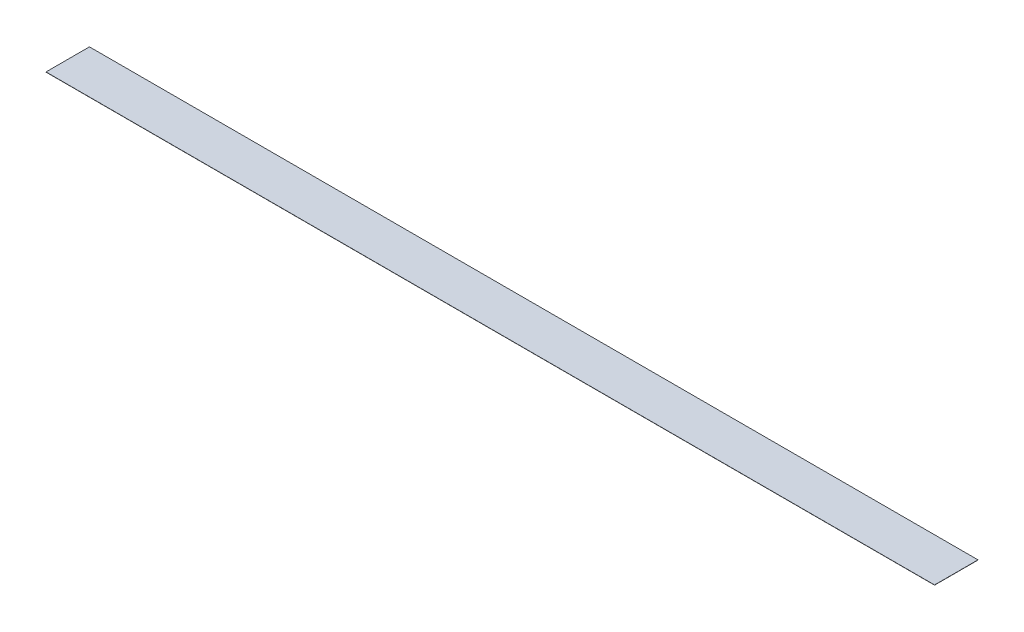
ISO-10303-21;
HEADER;
FILE_DESCRIPTION(('STEP AP214'),'2;1');
FILE_NAME('part.step','',(''),(''),'','','');
FILE_SCHEMA(('AUTOMOTIVE_DESIGN { 1 0 10303 214 1 1 1 1 }'));
ENDSEC;
DATA;
#1=APPLICATION_CONTEXT('core data for automotive mechanical design processes');
#2=APPLICATION_PROTOCOL_DEFINITION('international standard','automotive_design',2000,#1);
#3=PRODUCT_CONTEXT('',#1,'mechanical');
#4=PRODUCT('Part','Part','',(#3));
#5=PRODUCT_RELATED_PRODUCT_CATEGORY('part','',(#4));
#6=PRODUCT_DEFINITION_FORMATION('','',#4);
#7=PRODUCT_DEFINITION_CONTEXT('part definition',#1,'design');
#8=PRODUCT_DEFINITION('design','',#6,#7);
#9=PRODUCT_DEFINITION_SHAPE('','',#8);
#10=(LENGTH_UNIT() NAMED_UNIT(*) SI_UNIT(.MILLI.,.METRE.));
#11=(NAMED_UNIT(*) PLANE_ANGLE_UNIT() SI_UNIT($,.RADIAN.));
#12=(NAMED_UNIT(*) SI_UNIT($,.STERADIAN.) SOLID_ANGLE_UNIT());
#13=UNCERTAINTY_MEASURE_WITH_UNIT(LENGTH_MEASURE(1.E-05),#10,'distance_accuracy_value','');
#14=(GEOMETRIC_REPRESENTATION_CONTEXT(3) GLOBAL_UNCERTAINTY_ASSIGNED_CONTEXT((#13)) GLOBAL_UNIT_ASSIGNED_CONTEXT((#10,
#11,#12)) REPRESENTATION_CONTEXT('',''));
#15=CARTESIAN_POINT('',(0.,0.,0.));
#16=DIRECTION('',(0.,0.,1.));
#17=DIRECTION('',(1.,0.,0.));
#18=AXIS2_PLACEMENT_3D('',#15,#16,#17);
#19=CARTESIAN_POINT('',(0.,0.,0.));
#20=DIRECTION('',(-1.,0.,0.));
#21=DIRECTION('',(0.,0.,1.));
#22=AXIS2_PLACEMENT_3D('',#19,#20,#21);
#23=PLANE('',#22);
#24=DIRECTION('',(0.,0.,-1.));
#25=VECTOR('',#24,1.);
#26=CARTESIAN_POINT('',(0.,0.,22.));
#27=LINE('',#26,#25);
#28=CARTESIAN_POINT('',(0.,0.,22.));
#29=VERTEX_POINT('',#28);
#30=CARTESIAN_POINT('',(0.,0.,0.));
#31=VERTEX_POINT('',#30);
#32=EDGE_CURVE('E37',#29,#31,#27,.T.);
#33=ORIENTED_EDGE('',*,*,#32,.F.);
#34=DIRECTION('',(0.,1.,0.));
#35=VECTOR('',#34,1.);
#36=CARTESIAN_POINT('',(0.,0.,22.));
#37=LINE('',#36,#35);
#38=CARTESIAN_POINT('',(0.,0.1,22.));
#39=VERTEX_POINT('',#38);
#40=EDGE_CURVE('E11',#29,#39,#37,.T.);
#41=ORIENTED_EDGE('',*,*,#40,.T.);
#42=DIRECTION('',(0.,0.,1.));
#43=VECTOR('',#42,1.);
#44=CARTESIAN_POINT('',(0.,0.1,22.));
#45=LINE('',#44,#43);
#46=CARTESIAN_POINT('',(0.,0.1,0.));
#47=VERTEX_POINT('',#46);
#48=EDGE_CURVE('E49',#47,#39,#45,.T.);
#49=ORIENTED_EDGE('',*,*,#48,.F.);
#50=DIRECTION('',(0.,1.,0.));
#51=VECTOR('',#50,1.);
#52=CARTESIAN_POINT('',(0.,0.,0.));
#53=LINE('',#52,#51);
#54=EDGE_CURVE('E25',#31,#47,#53,.T.);
#55=ORIENTED_EDGE('',*,*,#54,.F.);
#56=EDGE_LOOP('',(#33,#41,#49,#55));
#57=FACE_BOUND('',#56,.T.);
#58=ADVANCED_FACE('F16',(#57),#23,.T.);
#59=CARTESIAN_POINT('',(450.,0.,0.));
#60=DIRECTION('',(0.,0.,-1.));
#61=DIRECTION('',(0.,-1.,0.));
#62=AXIS2_PLACEMENT_3D('',#59,#60,#61);
#63=PLANE('',#62);
#64=DIRECTION('',(1.,0.,0.));
#65=VECTOR('',#64,1.);
#66=CARTESIAN_POINT('',(0.,0.,0.));
#67=LINE('',#66,#65);
#68=CARTESIAN_POINT('',(450.,0.,0.));
#69=VERTEX_POINT('',#68);
#70=EDGE_CURVE('E88',#31,#69,#67,.T.);
#71=ORIENTED_EDGE('',*,*,#70,.F.);
#72=ORIENTED_EDGE('',*,*,#54,.T.);
#73=DIRECTION('',(-1.,0.,0.));
#74=VECTOR('',#73,1.);
#75=CARTESIAN_POINT('',(0.,0.1,0.));
#76=LINE('',#75,#74);
#77=CARTESIAN_POINT('',(450.,0.1,0.));
#78=VERTEX_POINT('',#77);
#79=EDGE_CURVE('E84',#78,#47,#76,.T.);
#80=ORIENTED_EDGE('',*,*,#79,.F.);
#81=DIRECTION('',(0.,1.,0.));
#82=VECTOR('',#81,1.);
#83=CARTESIAN_POINT('',(450.,0.,0.));
#84=LINE('',#83,#82);
#85=EDGE_CURVE('E94',#69,#78,#84,.T.);
#86=ORIENTED_EDGE('',*,*,#85,.F.);
#87=EDGE_LOOP('',(#71,#72,#80,#86));
#88=FACE_BOUND('',#87,.T.);
#89=ADVANCED_FACE('F96',(#88),#63,.T.);
#90=CARTESIAN_POINT('',(450.,0.,22.));
#91=DIRECTION('',(1.,0.,0.));
#92=DIRECTION('',(0.,1.,0.));
#93=AXIS2_PLACEMENT_3D('',#90,#91,#92);
#94=PLANE('',#93);
#95=DIRECTION('',(0.,0.,1.));
#96=VECTOR('',#95,1.);
#97=CARTESIAN_POINT('',(450.,0.,0.));
#98=LINE('',#97,#96);
#99=CARTESIAN_POINT('',(450.,0.,22.));
#100=VERTEX_POINT('',#99);
#101=EDGE_CURVE('E76',#69,#100,#98,.T.);
#102=ORIENTED_EDGE('',*,*,#101,.F.);
#103=ORIENTED_EDGE('',*,*,#85,.T.);
#104=DIRECTION('',(0.,0.,-1.));
#105=VECTOR('',#104,1.);
#106=CARTESIAN_POINT('',(450.,0.1,0.));
#107=LINE('',#106,#105);
#108=CARTESIAN_POINT('',(450.,0.1,22.));
#109=VERTEX_POINT('',#108);
#110=EDGE_CURVE('E64',#109,#78,#107,.T.);
#111=ORIENTED_EDGE('',*,*,#110,.F.);
#112=DIRECTION('',(0.,1.,0.));
#113=VECTOR('',#112,1.);
#114=CARTESIAN_POINT('',(450.,0.,22.));
#115=LINE('',#114,#113);
#116=EDGE_CURVE('E19',#100,#109,#115,.T.);
#117=ORIENTED_EDGE('',*,*,#116,.F.);
#118=EDGE_LOOP('',(#102,#103,#111,#117));
#119=FACE_BOUND('',#118,.T.);
#120=ADVANCED_FACE('F177',(#119),#94,.T.);
#121=CARTESIAN_POINT('',(0.,0.,22.));
#122=DIRECTION('',(0.,0.,1.));
#123=DIRECTION('',(1.,0.,0.));
#124=AXIS2_PLACEMENT_3D('',#121,#122,#123);
#125=PLANE('',#124);
#126=DIRECTION('',(-1.,0.,0.));
#127=VECTOR('',#126,1.);
#128=CARTESIAN_POINT('',(450.,0.,22.));
#129=LINE('',#128,#127);
#130=EDGE_CURVE('E90',#100,#29,#129,.T.);
#131=ORIENTED_EDGE('',*,*,#130,.F.);
#132=ORIENTED_EDGE('',*,*,#116,.T.);
#133=DIRECTION('',(1.,0.,0.));
#134=VECTOR('',#133,1.);
#135=CARTESIAN_POINT('',(450.,0.1,22.));
#136=LINE('',#135,#134);
#137=EDGE_CURVE('E108',#39,#109,#136,.T.);
#138=ORIENTED_EDGE('',*,*,#137,.F.);
#139=ORIENTED_EDGE('',*,*,#40,.F.);
#140=EDGE_LOOP('',(#131,#132,#138,#139));
#141=FACE_BOUND('',#140,.T.);
#142=ADVANCED_FACE('F166',(#141),#125,.T.);
#143=CARTESIAN_POINT('',(225.,0.1,11.));
#144=DIRECTION('',(0.,1.,0.));
#145=DIRECTION('',(1.,0.,0.));
#146=AXIS2_PLACEMENT_3D('',#143,#144,#145);
#147=PLANE('',#146);
#148=ORIENTED_EDGE('',*,*,#137,.T.);
#149=ORIENTED_EDGE('',*,*,#110,.T.);
#150=ORIENTED_EDGE('',*,*,#79,.T.);
#151=ORIENTED_EDGE('',*,*,#48,.T.);
#152=EDGE_LOOP('',(#148,#149,#150,#151));
#153=FACE_BOUND('',#152,.T.);
#154=ADVANCED_FACE('F154',(#153),#147,.T.);
#155=CARTESIAN_POINT('',(225.,0.,11.));
#156=DIRECTION('',(0.,1.,0.));
#157=DIRECTION('',(1.,0.,0.));
#158=AXIS2_PLACEMENT_3D('',#155,#156,#157);
#159=PLANE('',#158);
#160=ORIENTED_EDGE('',*,*,#130,.T.);
#161=ORIENTED_EDGE('',*,*,#32,.T.);
#162=ORIENTED_EDGE('',*,*,#70,.T.);
#163=ORIENTED_EDGE('',*,*,#101,.T.);
#164=EDGE_LOOP('',(#160,#161,#162,#163));
#165=FACE_BOUND('',#164,.T.);
#166=ADVANCED_FACE('F86',(#165),#159,.F.);
#167=CLOSED_SHELL('',(#58,#89,#120,#142,#154,#166));
#168=MANIFOLD_SOLID_BREP('B1',#167);
#169=ADVANCED_BREP_SHAPE_REPRESENTATION('',(#18,#168),#14);
#170=SHAPE_DEFINITION_REPRESENTATION(#9,#169);
ENDSEC;
END-ISO-10303-21;
